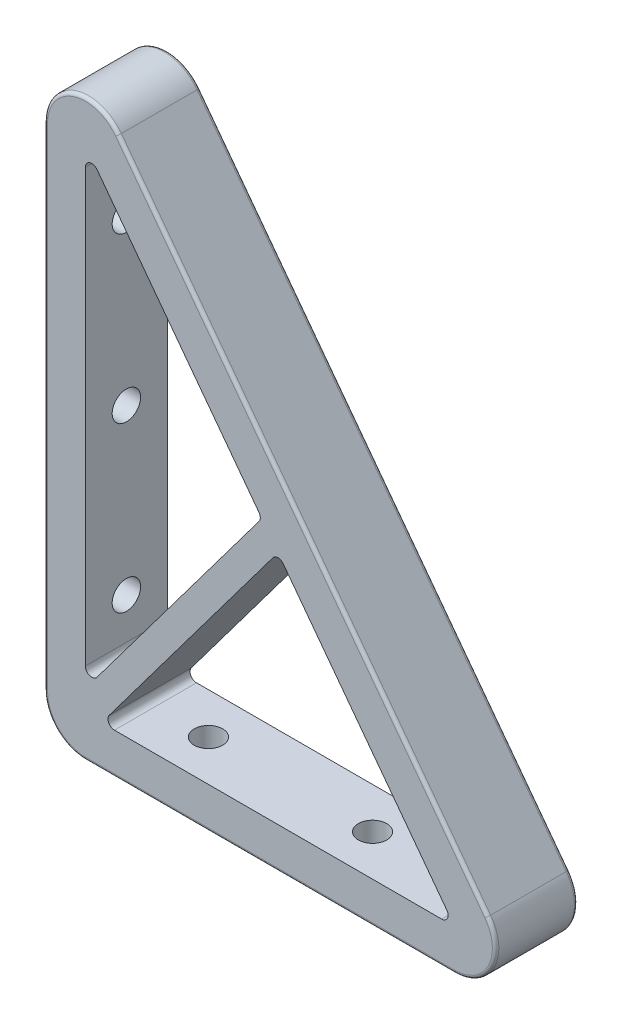
ISO-10303-21;
HEADER;
FILE_DESCRIPTION(('STEP AP214'),'2;1');
FILE_NAME('part.step','',(''),(''),'','','');
FILE_SCHEMA(('AUTOMOTIVE_DESIGN { 1 0 10303 214 1 1 1 1 }'));
ENDSEC;
DATA;
#1=APPLICATION_CONTEXT('core data for automotive mechanical design processes');
#2=APPLICATION_PROTOCOL_DEFINITION('international standard','automotive_design',2000,#1);
#3=PRODUCT_CONTEXT('',#1,'mechanical');
#4=PRODUCT('Part','Part','',(#3));
#5=PRODUCT_RELATED_PRODUCT_CATEGORY('part','',(#4));
#6=PRODUCT_DEFINITION_FORMATION('','',#4);
#7=PRODUCT_DEFINITION_CONTEXT('part definition',#1,'design');
#8=PRODUCT_DEFINITION('design','',#6,#7);
#9=PRODUCT_DEFINITION_SHAPE('','',#8);
#10=(LENGTH_UNIT() NAMED_UNIT(*) SI_UNIT(.MILLI.,.METRE.));
#11=(NAMED_UNIT(*) PLANE_ANGLE_UNIT() SI_UNIT($,.RADIAN.));
#12=(NAMED_UNIT(*) SI_UNIT($,.STERADIAN.) SOLID_ANGLE_UNIT());
#13=UNCERTAINTY_MEASURE_WITH_UNIT(LENGTH_MEASURE(1.E-05),#10,'distance_accuracy_value','');
#14=(GEOMETRIC_REPRESENTATION_CONTEXT(3) GLOBAL_UNCERTAINTY_ASSIGNED_CONTEXT((#13)) GLOBAL_UNIT_ASSIGNED_CONTEXT((#10,
#11,#12)) REPRESENTATION_CONTEXT('',''));
#15=CARTESIAN_POINT('',(0.,0.,0.));
#16=DIRECTION('',(0.,0.,1.));
#17=DIRECTION('',(1.,0.,0.));
#18=AXIS2_PLACEMENT_3D('',#15,#16,#17);
#19=CARTESIAN_POINT('',(0.,0.,12.7));
#20=DIRECTION('',(1.,0.,0.));
#21=DIRECTION('',(0.,1.,0.));
#22=AXIS2_PLACEMENT_3D('',#19,#20,#21);
#23=PLANE('',#22);
#24=CARTESIAN_POINT('',(0.,-82.55,6.35));
#25=DIRECTION('',(-1.,0.,0.));
#26=DIRECTION('',(0.,-1.,0.));
#27=AXIS2_PLACEMENT_3D('',#24,#25,#26);
#28=CIRCLE('',#27,2.19999999999999);
#29=CARTESIAN_POINT('',(0.,-84.75,6.35));
#30=VERTEX_POINT('',#29);
#31=EDGE_CURVE('E824',#30,#30,#28,.T.);
#32=ORIENTED_EDGE('',*,*,#31,.F.);
#33=EDGE_LOOP('',(#32));
#34=FACE_BOUND('',#33,.T.);
#35=CARTESIAN_POINT('',(0.,-57.15,6.35));
#36=DIRECTION('',(-1.,0.,0.));
#37=DIRECTION('',(0.,-1.,0.));
#38=AXIS2_PLACEMENT_3D('',#35,#36,#37);
#39=CIRCLE('',#38,2.2);
#40=CARTESIAN_POINT('',(0.,-59.35,6.35));
#41=VERTEX_POINT('',#40);
#42=EDGE_CURVE('E835',#41,#41,#39,.T.);
#43=ORIENTED_EDGE('',*,*,#42,.F.);
#44=EDGE_LOOP('',(#43));
#45=FACE_BOUND('',#44,.T.);
#46=CARTESIAN_POINT('',(0.,-31.75,6.35));
#47=DIRECTION('',(-1.,0.,0.));
#48=DIRECTION('',(0.,-1.,0.));
#49=AXIS2_PLACEMENT_3D('',#46,#47,#48);
#50=CIRCLE('',#49,2.2);
#51=CARTESIAN_POINT('',(0.,-33.95,6.35));
#52=VERTEX_POINT('',#51);
#53=EDGE_CURVE('E829',#52,#52,#50,.T.);
#54=ORIENTED_EDGE('',*,*,#53,.F.);
#55=EDGE_LOOP('',(#54));
#56=FACE_BOUND('',#55,.T.);
#57=DIRECTION('',(0.,0.,-1.));
#58=VECTOR('',#57,1.);
#59=CARTESIAN_POINT('',(0.,-95.25,12.7));
#60=LINE('',#59,#58);
#61=CARTESIAN_POINT('',(0.,-95.25,0.5));
#62=VERTEX_POINT('',#61);
#63=CARTESIAN_POINT('',(0.,-95.25,12.2));
#64=VERTEX_POINT('',#63);
#65=EDGE_CURVE('E382',#62,#64,#60,.F.);
#66=ORIENTED_EDGE('',*,*,#65,.T.);
#67=DIRECTION('',(0.,-1.,0.));
#68=VECTOR('',#67,1.);
#69=CARTESIAN_POINT('',(0.,-19.05,12.2));
#70=LINE('',#69,#68);
#71=CARTESIAN_POINT('',(0.,-19.05,12.2));
#72=VERTEX_POINT('',#71);
#73=EDGE_CURVE('E11',#64,#72,#70,.F.);
#74=ORIENTED_EDGE('',*,*,#73,.T.);
#75=DIRECTION('',(0.,0.,-1.));
#76=VECTOR('',#75,1.);
#77=CARTESIAN_POINT('',(0.,-19.05,0.));
#78=LINE('',#77,#76);
#79=CARTESIAN_POINT('',(0.,-19.05,0.5));
#80=VERTEX_POINT('',#79);
#81=EDGE_CURVE('E379',#72,#80,#78,.T.);
#82=ORIENTED_EDGE('',*,*,#81,.T.);
#83=DIRECTION('',(0.,-1.,0.));
#84=VECTOR('',#83,1.);
#85=CARTESIAN_POINT('',(0.,0.,0.5));
#86=LINE('',#85,#84);
#87=EDGE_CURVE('E45',#80,#62,#86,.T.);
#88=ORIENTED_EDGE('',*,*,#87,.T.);
#89=EDGE_LOOP('',(#66,#74,#82,#88));
#90=FACE_BOUND('',#89,.T.);
#91=ADVANCED_FACE('F36',(#34,#45,#56,#90),#23,.F.);
#92=CARTESIAN_POINT('',(0.,-101.6,12.7));
#93=DIRECTION('',(0.,1.,0.));
#94=DIRECTION('',(0.,0.,1.));
#95=AXIS2_PLACEMENT_3D('',#92,#93,#94);
#96=PLANE('',#95);
#97=CARTESIAN_POINT('',(19.05,-101.6,6.35));
#98=DIRECTION('',(0.,-1.,0.));
#99=DIRECTION('',(0.,0.,-1.));
#100=AXIS2_PLACEMENT_3D('',#97,#98,#99);
#101=CIRCLE('',#100,2.2);
#102=CARTESIAN_POINT('',(19.05,-101.6,4.15));
#103=VERTEX_POINT('',#102);
#104=EDGE_CURVE('E772',#103,#103,#101,.T.);
#105=ORIENTED_EDGE('',*,*,#104,.F.);
#106=EDGE_LOOP('',(#105));
#107=FACE_BOUND('',#106,.T.);
#108=CARTESIAN_POINT('',(44.45,-101.6,6.35));
#109=DIRECTION('',(0.,-1.,0.));
#110=DIRECTION('',(0.,0.,-1.));
#111=AXIS2_PLACEMENT_3D('',#108,#109,#110);
#112=CIRCLE('',#111,2.2);
#113=CARTESIAN_POINT('',(44.45,-101.6,4.15));
#114=VERTEX_POINT('',#113);
#115=EDGE_CURVE('E817',#114,#114,#112,.T.);
#116=ORIENTED_EDGE('',*,*,#115,.F.);
#117=EDGE_LOOP('',(#116));
#118=FACE_BOUND('',#117,.T.);
#119=DIRECTION('',(0.,0.,-1.));
#120=VECTOR('',#119,1.);
#121=CARTESIAN_POINT('',(6.35000000000001,-101.6,12.7));
#122=LINE('',#121,#120);
#123=CARTESIAN_POINT('',(6.35000000000001,-101.6,12.2));
#124=VERTEX_POINT('',#123);
#125=CARTESIAN_POINT('',(6.35000000000001,-101.6,0.5));
#126=VERTEX_POINT('',#125);
#127=EDGE_CURVE('E370',#124,#126,#122,.T.);
#128=ORIENTED_EDGE('',*,*,#127,.T.);
#129=DIRECTION('',(1.,0.,0.));
#130=VECTOR('',#129,1.);
#131=CARTESIAN_POINT('',(0.,-101.6,0.5));
#132=LINE('',#131,#130);
#133=CARTESIAN_POINT('',(63.5,-101.6,0.5));
#134=VERTEX_POINT('',#133);
#135=EDGE_CURVE('E307',#126,#134,#132,.T.);
#136=ORIENTED_EDGE('',*,*,#135,.T.);
#137=DIRECTION('',(0.,0.,-1.));
#138=VECTOR('',#137,1.);
#139=CARTESIAN_POINT('',(63.5,-101.6,12.7));
#140=LINE('',#139,#138);
#141=CARTESIAN_POINT('',(63.5,-101.6,12.2));
#142=VERTEX_POINT('',#141);
#143=EDGE_CURVE('E373',#134,#142,#140,.F.);
#144=ORIENTED_EDGE('',*,*,#143,.T.);
#145=DIRECTION('',(1.,0.,0.));
#146=VECTOR('',#145,1.);
#147=CARTESIAN_POINT('',(6.35000000000001,-101.6,12.2));
#148=LINE('',#147,#146);
#149=EDGE_CURVE('E305',#142,#124,#148,.F.);
#150=ORIENTED_EDGE('',*,*,#149,.T.);
#151=EDGE_LOOP('',(#128,#136,#144,#150));
#152=FACE_BOUND('',#151,.T.);
#153=ADVANCED_FACE('F369',(#107,#118,#152),#96,.F.);
#154=CARTESIAN_POINT('',(-5.08000000000003,-3.81000000000002,12.7));
#155=DIRECTION('',(-0.8,-0.6,0.));
#156=DIRECTION('',(0.6,-0.8,0.));
#157=AXIS2_PLACEMENT_3D('',#154,#155,#156);
#158=PLANE('',#157);
#159=DIRECTION('',(-0.6,0.8,0.));
#160=VECTOR('',#159,1.);
#161=CARTESIAN_POINT('',(-5.08000000000003,-3.81000000000002,12.7));
#162=LINE('',#161,#160);
#163=CARTESIAN_POINT('',(62.3,-93.65,12.7));
#164=VERTEX_POINT('',#163);
#165=CARTESIAN_POINT('',(36.975,-59.8833333333334,12.7));
#166=VERTEX_POINT('',#165);
#167=EDGE_CURVE('E787',#164,#166,#162,.T.);
#168=ORIENTED_EDGE('',*,*,#167,.T.);
#169=DIRECTION('',(0.,0.,-1.));
#170=VECTOR('',#169,1.);
#171=CARTESIAN_POINT('',(36.975,-59.8833333333334,12.7));
#172=LINE('',#171,#170);
#173=CARTESIAN_POINT('',(36.975,-59.8833333333334,0.));
#174=VERTEX_POINT('',#173);
#175=EDGE_CURVE('E220',#166,#174,#172,.T.);
#176=ORIENTED_EDGE('',*,*,#175,.T.);
#177=DIRECTION('',(-0.6,0.8,0.));
#178=VECTOR('',#177,1.);
#179=CARTESIAN_POINT('',(-5.08000000000003,-3.81000000000002,0.));
#180=LINE('',#179,#178);
#181=CARTESIAN_POINT('',(62.3,-93.65,0.));
#182=VERTEX_POINT('',#181);
#183=EDGE_CURVE('E203',#182,#174,#180,.T.);
#184=ORIENTED_EDGE('',*,*,#183,.F.);
#185=DIRECTION('',(0.,0.,-1.));
#186=VECTOR('',#185,1.);
#187=CARTESIAN_POINT('',(62.3,-93.65,12.7));
#188=LINE('',#187,#186);
#189=EDGE_CURVE('E217',#182,#164,#188,.F.);
#190=ORIENTED_EDGE('',*,*,#189,.T.);
#191=EDGE_LOOP('',(#168,#176,#184,#190));
#192=FACE_BOUND('',#191,.T.);
#193=ADVANCED_FACE('F216',(#192),#158,.T.);
#194=CARTESIAN_POINT('',(0.,-95.25,12.7));
#195=DIRECTION('',(0.,1.,0.));
#196=DIRECTION('',(0.,0.,1.));
#197=AXIS2_PLACEMENT_3D('',#194,#195,#196);
#198=PLANE('',#197);
#199=CARTESIAN_POINT('',(19.05,-95.25,6.35));
#200=DIRECTION('',(0.,1.,0.));
#201=DIRECTION('',(0.,0.,1.));
#202=AXIS2_PLACEMENT_3D('',#199,#200,#201);
#203=CIRCLE('',#202,2.2);
#204=CARTESIAN_POINT('',(19.05,-95.25,8.55));
#205=VERTEX_POINT('',#204);
#206=EDGE_CURVE('E820',#205,#205,#203,.F.);
#207=ORIENTED_EDGE('',*,*,#206,.T.);
#208=EDGE_LOOP('',(#207));
#209=FACE_BOUND('',#208,.T.);
#210=CARTESIAN_POINT('',(44.45,-95.25,6.35));
#211=DIRECTION('',(0.,1.,0.));
#212=DIRECTION('',(0.,0.,1.));
#213=AXIS2_PLACEMENT_3D('',#210,#211,#212);
#214=CIRCLE('',#213,2.2);
#215=CARTESIAN_POINT('',(44.45,-95.25,8.55));
#216=VERTEX_POINT('',#215);
#217=EDGE_CURVE('E821',#216,#216,#214,.F.);
#218=ORIENTED_EDGE('',*,*,#217,.T.);
#219=EDGE_LOOP('',(#218));
#220=FACE_BOUND('',#219,.T.);
#221=DIRECTION('',(1.,0.,0.));
#222=VECTOR('',#221,1.);
#223=CARTESIAN_POINT('',(0.,-95.25,12.7));
#224=LINE('',#223,#222);
#225=CARTESIAN_POINT('',(10.85,-95.25,12.7));
#226=VERTEX_POINT('',#225);
#227=CARTESIAN_POINT('',(61.5,-95.25,12.7));
#228=VERTEX_POINT('',#227);
#229=EDGE_CURVE('E793',#226,#228,#224,.T.);
#230=ORIENTED_EDGE('',*,*,#229,.T.);
#231=DIRECTION('',(0.,0.,-1.));
#232=VECTOR('',#231,1.);
#233=CARTESIAN_POINT('',(61.5,-95.25,0.));
#234=LINE('',#233,#232);
#235=CARTESIAN_POINT('',(61.5,-95.25,0.));
#236=VERTEX_POINT('',#235);
#237=EDGE_CURVE('E256',#228,#236,#234,.T.);
#238=ORIENTED_EDGE('',*,*,#237,.T.);
#239=DIRECTION('',(1.,0.,0.));
#240=VECTOR('',#239,1.);
#241=CARTESIAN_POINT('',(0.,-95.25,0.));
#242=LINE('',#241,#240);
#243=CARTESIAN_POINT('',(10.85,-95.25,0.));
#244=VERTEX_POINT('',#243);
#245=EDGE_CURVE('E205',#244,#236,#242,.T.);
#246=ORIENTED_EDGE('',*,*,#245,.F.);
#247=DIRECTION('',(0.,0.,-1.));
#248=VECTOR('',#247,1.);
#249=CARTESIAN_POINT('',(10.85,-95.25,12.7));
#250=LINE('',#249,#248);
#251=EDGE_CURVE('E254',#244,#226,#250,.F.);
#252=ORIENTED_EDGE('',*,*,#251,.T.);
#253=EDGE_LOOP('',(#230,#238,#246,#252));
#254=FACE_BOUND('',#253,.T.);
#255=ADVANCED_FACE('F453',(#209,#220,#254),#198,.T.);
#256=CARTESIAN_POINT('',(33.225,-54.8833333333334,0.));
#257=VERTEX_POINT('',#256);
#258=CARTESIAN_POINT('',(8.15,-21.4500000000001,0.));
#259=VERTEX_POINT('',#258);
#260=EDGE_CURVE('E223',#257,#259,#180,.T.);
#261=ORIENTED_EDGE('',*,*,#260,.F.);
#262=DIRECTION('',(0.,0.,-1.));
#263=VECTOR('',#262,1.);
#264=CARTESIAN_POINT('',(33.225,-54.8833333333334,12.7));
#265=LINE('',#264,#263);
#266=CARTESIAN_POINT('',(33.225,-54.8833333333334,12.7));
#267=VERTEX_POINT('',#266);
#268=EDGE_CURVE('E247',#257,#267,#265,.F.);
#269=ORIENTED_EDGE('',*,*,#268,.T.);
#270=CARTESIAN_POINT('',(8.15,-21.4500000000001,12.7));
#271=VERTEX_POINT('',#270);
#272=EDGE_CURVE('E780',#267,#271,#162,.T.);
#273=ORIENTED_EDGE('',*,*,#272,.T.);
#274=DIRECTION('',(0.,0.,-1.));
#275=VECTOR('',#274,1.);
#276=CARTESIAN_POINT('',(8.15,-21.4500000000001,0.));
#277=LINE('',#276,#275);
#278=EDGE_CURVE('E244',#271,#259,#277,.T.);
#279=ORIENTED_EDGE('',*,*,#278,.T.);
#280=EDGE_LOOP('',(#261,#269,#273,#279));
#281=FACE_BOUND('',#280,.T.);
#282=ADVANCED_FACE('F456',(#281),#158,.T.);
#283=CARTESIAN_POINT('',(48.184,-36.138,12.7));
#284=DIRECTION('',(-0.8,0.6,0.));
#285=DIRECTION('',(-0.6,-0.8,0.));
#286=AXIS2_PLACEMENT_3D('',#283,#284,#285);
#287=PLANE('',#286);
#288=DIRECTION('',(0.6,0.8,0.));
#289=VECTOR('',#288,1.);
#290=CARTESIAN_POINT('',(48.184,-36.138,12.7));
#291=LINE('',#290,#289);
#292=CARTESIAN_POINT('',(8.15,-89.5166666666667,12.7));
#293=VERTEX_POINT('',#292);
#294=CARTESIAN_POINT('',(33.225,-56.0833333333333,12.7));
#295=VERTEX_POINT('',#294);
#296=EDGE_CURVE('E778',#293,#295,#291,.T.);
#297=ORIENTED_EDGE('',*,*,#296,.T.);
#298=DIRECTION('',(0.,0.,-1.));
#299=VECTOR('',#298,1.);
#300=CARTESIAN_POINT('',(33.225,-56.0833333333333,0.));
#301=LINE('',#300,#299);
#302=CARTESIAN_POINT('',(33.225,-56.0833333333333,0.));
#303=VERTEX_POINT('',#302);
#304=EDGE_CURVE('E241',#295,#303,#301,.T.);
#305=ORIENTED_EDGE('',*,*,#304,.T.);
#306=DIRECTION('',(0.6,0.8,0.));
#307=VECTOR('',#306,1.);
#308=CARTESIAN_POINT('',(48.184,-36.138,0.));
#309=LINE('',#308,#307);
#310=CARTESIAN_POINT('',(8.15,-89.5166666666667,0.));
#311=VERTEX_POINT('',#310);
#312=EDGE_CURVE('E771',#311,#303,#309,.T.);
#313=ORIENTED_EDGE('',*,*,#312,.F.);
#314=DIRECTION('',(0.,0.,-1.));
#315=VECTOR('',#314,1.);
#316=CARTESIAN_POINT('',(8.15000000000001,-89.5166666666667,12.7));
#317=LINE('',#316,#315);
#318=EDGE_CURVE('E239',#311,#293,#317,.F.);
#319=ORIENTED_EDGE('',*,*,#318,.T.);
#320=EDGE_LOOP('',(#297,#305,#313,#319));
#321=FACE_BOUND('',#320,.T.);
#322=ADVANCED_FACE('F451',(#321),#287,.T.);
#323=CARTESIAN_POINT('',(51.384,-38.538,12.7));
#324=DIRECTION('',(-0.8,0.6,0.));
#325=DIRECTION('',(-0.6,-0.8,0.));
#326=AXIS2_PLACEMENT_3D('',#323,#324,#325);
#327=PLANE('',#326);
#328=DIRECTION('',(0.6,0.8,0.));
#329=VECTOR('',#328,1.);
#330=CARTESIAN_POINT('',(51.384,-38.538,0.));
#331=LINE('',#330,#329);
#332=CARTESIAN_POINT('',(10.05,-93.65,0.));
#333=VERTEX_POINT('',#332);
#334=CARTESIAN_POINT('',(35.375,-59.8833333333334,0.));
#335=VERTEX_POINT('',#334);
#336=EDGE_CURVE('E789',#333,#335,#331,.T.);
#337=ORIENTED_EDGE('',*,*,#336,.T.);
#338=DIRECTION('',(0.,0.,-1.));
#339=VECTOR('',#338,1.);
#340=CARTESIAN_POINT('',(35.375,-59.8833333333334,12.7));
#341=LINE('',#340,#339);
#342=CARTESIAN_POINT('',(35.375,-59.8833333333334,12.7));
#343=VERTEX_POINT('',#342);
#344=EDGE_CURVE('E237',#335,#343,#341,.F.);
#345=ORIENTED_EDGE('',*,*,#344,.T.);
#346=DIRECTION('',(0.6,0.8,0.));
#347=VECTOR('',#346,1.);
#348=CARTESIAN_POINT('',(51.384,-38.538,12.7));
#349=LINE('',#348,#347);
#350=CARTESIAN_POINT('',(10.05,-93.65,12.7));
#351=VERTEX_POINT('',#350);
#352=EDGE_CURVE('E384',#351,#343,#349,.T.);
#353=ORIENTED_EDGE('',*,*,#352,.F.);
#354=DIRECTION('',(0.,0.,-1.));
#355=VECTOR('',#354,1.);
#356=CARTESIAN_POINT('',(10.05,-93.65,12.7));
#357=LINE('',#356,#355);
#358=EDGE_CURVE('E228',#351,#333,#357,.T.);
#359=ORIENTED_EDGE('',*,*,#358,.T.);
#360=EDGE_LOOP('',(#337,#345,#353,#359));
#361=FACE_BOUND('',#360,.T.);
#362=ADVANCED_FACE('F447',(#361),#327,.F.);
#363=CARTESIAN_POINT('',(6.35,0.,12.7));
#364=DIRECTION('',(1.,0.,0.));
#365=DIRECTION('',(0.,1.,0.));
#366=AXIS2_PLACEMENT_3D('',#363,#364,#365);
#367=PLANE('',#366);
#368=CARTESIAN_POINT('',(6.35000000000001,-82.55,6.35));
#369=DIRECTION('',(1.,0.,0.));
#370=DIRECTION('',(0.,1.,0.));
#371=AXIS2_PLACEMENT_3D('',#368,#369,#370);
#372=CIRCLE('',#371,2.19999999999999);
#373=CARTESIAN_POINT('',(6.35000000000001,-80.35,6.35));
#374=VERTEX_POINT('',#373);
#375=EDGE_CURVE('E838',#374,#374,#372,.F.);
#376=ORIENTED_EDGE('',*,*,#375,.T.);
#377=EDGE_LOOP('',(#376));
#378=FACE_BOUND('',#377,.T.);
#379=CARTESIAN_POINT('',(6.35000000000001,-57.15,6.35));
#380=DIRECTION('',(1.,0.,0.));
#381=DIRECTION('',(0.,1.,0.));
#382=AXIS2_PLACEMENT_3D('',#379,#380,#381);
#383=CIRCLE('',#382,2.2);
#384=CARTESIAN_POINT('',(6.35000000000001,-54.95,6.35));
#385=VERTEX_POINT('',#384);
#386=EDGE_CURVE('E832',#385,#385,#383,.F.);
#387=ORIENTED_EDGE('',*,*,#386,.T.);
#388=EDGE_LOOP('',(#387));
#389=FACE_BOUND('',#388,.T.);
#390=CARTESIAN_POINT('',(6.34999999999999,-31.75,6.35));
#391=DIRECTION('',(1.,0.,0.));
#392=DIRECTION('',(0.,1.,0.));
#393=AXIS2_PLACEMENT_3D('',#390,#391,#392);
#394=CIRCLE('',#393,2.2);
#395=CARTESIAN_POINT('',(6.34999999999999,-29.55,6.35));
#396=VERTEX_POINT('',#395);
#397=EDGE_CURVE('E341',#396,#396,#394,.F.);
#398=ORIENTED_EDGE('',*,*,#397,.T.);
#399=EDGE_LOOP('',(#398));
#400=FACE_BOUND('',#399,.T.);
#401=DIRECTION('',(0.,-1.,0.));
#402=VECTOR('',#401,1.);
#403=CARTESIAN_POINT('',(6.35,0.,12.7));
#404=LINE('',#403,#402);
#405=CARTESIAN_POINT('',(6.35,-22.0500000000001,12.7));
#406=VERTEX_POINT('',#405);
#407=CARTESIAN_POINT('',(6.35000000000001,-88.9166666666667,12.7));
#408=VERTEX_POINT('',#407);
#409=EDGE_CURVE('E784',#406,#408,#404,.T.);
#410=ORIENTED_EDGE('',*,*,#409,.T.);
#411=DIRECTION('',(0.,0.,-1.));
#412=VECTOR('',#411,1.);
#413=CARTESIAN_POINT('',(6.35000000000001,-88.9166666666667,0.));
#414=LINE('',#413,#412);
#415=CARTESIAN_POINT('',(6.35000000000001,-88.9166666666667,0.));
#416=VERTEX_POINT('',#415);
#417=EDGE_CURVE('E251',#408,#416,#414,.T.);
#418=ORIENTED_EDGE('',*,*,#417,.T.);
#419=DIRECTION('',(0.,-1.,0.));
#420=VECTOR('',#419,1.);
#421=CARTESIAN_POINT('',(6.35,0.,0.));
#422=LINE('',#421,#420);
#423=CARTESIAN_POINT('',(6.35,-22.0500000000001,0.));
#424=VERTEX_POINT('',#423);
#425=EDGE_CURVE('E221',#424,#416,#422,.T.);
#426=ORIENTED_EDGE('',*,*,#425,.F.);
#427=DIRECTION('',(0.,0.,-1.));
#428=VECTOR('',#427,1.);
#429=CARTESIAN_POINT('',(6.35,-22.0500000000001,12.7));
#430=LINE('',#429,#428);
#431=EDGE_CURVE('E249',#424,#406,#430,.F.);
#432=ORIENTED_EDGE('',*,*,#431,.T.);
#433=EDGE_LOOP('',(#410,#418,#426,#432));
#434=FACE_BOUND('',#433,.T.);
#435=ADVANCED_FACE('F450',(#378,#389,#400,#434),#367,.T.);
#436=CARTESIAN_POINT('',(0.,0.,12.7));
#437=DIRECTION('',(0.8,0.6,0.));
#438=DIRECTION('',(-0.6,0.8,0.));
#439=AXIS2_PLACEMENT_3D('',#436,#437,#438);
#440=PLANE('',#439);
#441=DIRECTION('',(0.,0.,-1.));
#442=VECTOR('',#441,1.);
#443=CARTESIAN_POINT('',(68.58,-91.44,0.));
#444=LINE('',#443,#442);
#445=CARTESIAN_POINT('',(68.58,-91.44,12.2));
#446=VERTEX_POINT('',#445);
#447=CARTESIAN_POINT('',(68.58,-91.44,0.5));
#448=VERTEX_POINT('',#447);
#449=EDGE_CURVE('E231',#446,#448,#444,.T.);
#450=ORIENTED_EDGE('',*,*,#449,.T.);
#451=DIRECTION('',(0.6,-0.8,0.));
#452=VECTOR('',#451,1.);
#453=CARTESIAN_POINT('',(11.43,-15.24,0.5));
#454=LINE('',#453,#452);
#455=CARTESIAN_POINT('',(11.43,-15.24,0.5));
#456=VERTEX_POINT('',#455);
#457=EDGE_CURVE('E299',#448,#456,#454,.F.);
#458=ORIENTED_EDGE('',*,*,#457,.T.);
#459=DIRECTION('',(0.,0.,-1.));
#460=VECTOR('',#459,1.);
#461=CARTESIAN_POINT('',(11.43,-15.24,12.7));
#462=LINE('',#461,#460);
#463=CARTESIAN_POINT('',(11.43,-15.24,12.2));
#464=VERTEX_POINT('',#463);
#465=EDGE_CURVE('E226',#456,#464,#462,.F.);
#466=ORIENTED_EDGE('',*,*,#465,.T.);
#467=DIRECTION('',(0.6,-0.8,0.));
#468=VECTOR('',#467,1.);
#469=CARTESIAN_POINT('',(0.,0.,12.2));
#470=LINE('',#469,#468);
#471=EDGE_CURVE('E297',#464,#446,#470,.T.);
#472=ORIENTED_EDGE('',*,*,#471,.T.);
#473=EDGE_LOOP('',(#450,#458,#466,#472));
#474=FACE_BOUND('',#473,.T.);
#475=ADVANCED_FACE('F392',(#474),#440,.T.);
#476=CARTESIAN_POINT('',(0.,0.,12.7));
#477=DIRECTION('',(0.,0.,1.));
#478=DIRECTION('',(1.,0.,0.));
#479=AXIS2_PLACEMENT_3D('',#476,#477,#478);
#480=PLANE('',#479);
#481=DIRECTION('',(0.6,-0.8,0.));
#482=VECTOR('',#481,1.);
#483=CARTESIAN_POINT('',(-0.399999999999999,-0.299999999999999,12.7));
#484=LINE('',#483,#482);
#485=CARTESIAN_POINT('',(68.18,-91.74,12.7));
#486=VERTEX_POINT('',#485);
#487=CARTESIAN_POINT('',(11.03,-15.54,12.7));
#488=VERTEX_POINT('',#487);
#489=EDGE_CURVE('E313',#486,#488,#484,.F.);
#490=ORIENTED_EDGE('',*,*,#489,.T.);
#491=CARTESIAN_POINT('',(6.35,-19.05,12.7));
#492=DIRECTION('',(0.,0.,1.));
#493=DIRECTION('',(1.,0.,0.));
#494=AXIS2_PLACEMENT_3D('',#491,#492,#493);
#495=CIRCLE('',#494,5.85);
#496=CARTESIAN_POINT('',(0.500000000000002,-19.05,12.7));
#497=VERTEX_POINT('',#496);
#498=EDGE_CURVE('E322',#488,#497,#495,.T.);
#499=ORIENTED_EDGE('',*,*,#498,.T.);
#500=DIRECTION('',(0.,-1.,0.));
#501=VECTOR('',#500,1.);
#502=CARTESIAN_POINT('',(0.500000000000012,-95.25,12.7));
#503=LINE('',#502,#501);
#504=CARTESIAN_POINT('',(0.500000000000012,-95.25,12.7));
#505=VERTEX_POINT('',#504);
#506=EDGE_CURVE('E60',#497,#505,#503,.T.);
#507=ORIENTED_EDGE('',*,*,#506,.T.);
#508=CARTESIAN_POINT('',(6.35000000000001,-95.25,12.7));
#509=DIRECTION('',(0.,0.,1.));
#510=DIRECTION('',(1.,0.,0.));
#511=AXIS2_PLACEMENT_3D('',#508,#509,#510);
#512=CIRCLE('',#511,5.85);
#513=CARTESIAN_POINT('',(6.35000000000001,-101.1,12.7));
#514=VERTEX_POINT('',#513);
#515=EDGE_CURVE('E319',#505,#514,#512,.T.);
#516=ORIENTED_EDGE('',*,*,#515,.T.);
#517=DIRECTION('',(1.,0.,0.));
#518=VECTOR('',#517,1.);
#519=CARTESIAN_POINT('',(63.5,-101.1,12.7));
#520=LINE('',#519,#518);
#521=CARTESIAN_POINT('',(63.5,-101.1,12.7));
#522=VERTEX_POINT('',#521);
#523=EDGE_CURVE('E317',#514,#522,#520,.T.);
#524=ORIENTED_EDGE('',*,*,#523,.T.);
#525=CARTESIAN_POINT('',(63.5,-95.25,12.7));
#526=DIRECTION('',(0.,0.,1.));
#527=DIRECTION('',(1.,0.,0.));
#528=AXIS2_PLACEMENT_3D('',#525,#526,#527);
#529=CIRCLE('',#528,5.85);
#530=EDGE_CURVE('E315',#522,#486,#529,.T.);
#531=ORIENTED_EDGE('',*,*,#530,.T.);
#532=EDGE_LOOP('',(#490,#499,#507,#516,#524,#531));
#533=FACE_BOUND('',#532,.T.);
#534=ORIENTED_EDGE('',*,*,#272,.F.);
#535=CARTESIAN_POINT('',(32.425,-55.4833333333334,12.7));
#536=DIRECTION('',(0.,0.,1.));
#537=DIRECTION('',(1.,0.,0.));
#538=AXIS2_PLACEMENT_3D('',#535,#536,#537);
#539=CIRCLE('',#538,1.);
#540=EDGE_CURVE('E264',#267,#295,#539,.F.);
#541=ORIENTED_EDGE('',*,*,#540,.T.);
#542=ORIENTED_EDGE('',*,*,#296,.F.);
#543=CARTESIAN_POINT('',(7.35000000000001,-88.9166666666667,12.7));
#544=DIRECTION('',(0.,0.,1.));
#545=DIRECTION('',(1.,0.,0.));
#546=AXIS2_PLACEMENT_3D('',#543,#544,#545);
#547=CIRCLE('',#546,1.);
#548=EDGE_CURVE('E211',#293,#408,#547,.F.);
#549=ORIENTED_EDGE('',*,*,#548,.T.);
#550=ORIENTED_EDGE('',*,*,#409,.F.);
#551=CARTESIAN_POINT('',(7.35,-22.0500000000001,12.7));
#552=DIRECTION('',(0.,0.,1.));
#553=DIRECTION('',(1.,0.,0.));
#554=AXIS2_PLACEMENT_3D('',#551,#552,#553);
#555=CIRCLE('',#554,1.);
#556=EDGE_CURVE('E272',#406,#271,#555,.F.);
#557=ORIENTED_EDGE('',*,*,#556,.T.);
#558=EDGE_LOOP('',(#534,#541,#542,#549,#550,#557));
#559=FACE_BOUND('',#558,.T.);
#560=ORIENTED_EDGE('',*,*,#167,.F.);
#561=CARTESIAN_POINT('',(61.5,-94.25,12.7));
#562=DIRECTION('',(0.,0.,1.));
#563=DIRECTION('',(1.,0.,0.));
#564=AXIS2_PLACEMENT_3D('',#561,#562,#563);
#565=CIRCLE('',#564,1.);
#566=EDGE_CURVE('E210',#164,#228,#565,.F.);
#567=ORIENTED_EDGE('',*,*,#566,.T.);
#568=ORIENTED_EDGE('',*,*,#229,.F.);
#569=CARTESIAN_POINT('',(10.85,-94.25,12.7));
#570=DIRECTION('',(0.,0.,1.));
#571=DIRECTION('',(1.,0.,0.));
#572=AXIS2_PLACEMENT_3D('',#569,#570,#571);
#573=CIRCLE('',#572,1.);
#574=EDGE_CURVE('E276',#226,#351,#573,.F.);
#575=ORIENTED_EDGE('',*,*,#574,.T.);
#576=ORIENTED_EDGE('',*,*,#352,.T.);
#577=CARTESIAN_POINT('',(36.175,-60.4833333333334,12.7));
#578=DIRECTION('',(0.,0.,1.));
#579=DIRECTION('',(1.,0.,0.));
#580=AXIS2_PLACEMENT_3D('',#577,#578,#579);
#581=CIRCLE('',#580,1.);
#582=EDGE_CURVE('E260',#343,#166,#581,.F.);
#583=ORIENTED_EDGE('',*,*,#582,.T.);
#584=EDGE_LOOP('',(#560,#567,#568,#575,#576,#583));
#585=FACE_BOUND('',#584,.T.);
#586=ADVANCED_FACE('F419',(#533,#559,#585),#480,.T.);
#587=CARTESIAN_POINT('',(0.,0.,0.));
#588=DIRECTION('',(0.,0.,1.));
#589=DIRECTION('',(1.,0.,0.));
#590=AXIS2_PLACEMENT_3D('',#587,#588,#589);
#591=PLANE('',#590);
#592=DIRECTION('',(0.,-1.,0.));
#593=VECTOR('',#592,1.);
#594=CARTESIAN_POINT('',(0.5,0.,0.));
#595=LINE('',#594,#593);
#596=CARTESIAN_POINT('',(0.500000000000012,-95.25,0.));
#597=VERTEX_POINT('',#596);
#598=CARTESIAN_POINT('',(0.500000000000002,-19.05,0.));
#599=VERTEX_POINT('',#598);
#600=EDGE_CURVE('E278',#597,#599,#595,.F.);
#601=ORIENTED_EDGE('',*,*,#600,.T.);
#602=CARTESIAN_POINT('',(6.35,-19.05,0.));
#603=DIRECTION('',(0.,0.,1.));
#604=DIRECTION('',(1.,0.,0.));
#605=AXIS2_PLACEMENT_3D('',#602,#603,#604);
#606=CIRCLE('',#605,5.85);
#607=CARTESIAN_POINT('',(11.03,-15.54,0.));
#608=VERTEX_POINT('',#607);
#609=EDGE_CURVE('E288',#599,#608,#606,.F.);
#610=ORIENTED_EDGE('',*,*,#609,.T.);
#611=DIRECTION('',(0.6,-0.8,0.));
#612=VECTOR('',#611,1.);
#613=CARTESIAN_POINT('',(68.18,-91.74,0.));
#614=LINE('',#613,#612);
#615=CARTESIAN_POINT('',(68.18,-91.74,0.));
#616=VERTEX_POINT('',#615);
#617=EDGE_CURVE('E286',#608,#616,#614,.T.);
#618=ORIENTED_EDGE('',*,*,#617,.T.);
#619=CARTESIAN_POINT('',(63.5,-95.25,0.));
#620=DIRECTION('',(0.,0.,1.));
#621=DIRECTION('',(1.,0.,0.));
#622=AXIS2_PLACEMENT_3D('',#619,#620,#621);
#623=CIRCLE('',#622,5.85);
#624=CARTESIAN_POINT('',(63.5,-101.1,0.));
#625=VERTEX_POINT('',#624);
#626=EDGE_CURVE('E284',#616,#625,#623,.F.);
#627=ORIENTED_EDGE('',*,*,#626,.T.);
#628=DIRECTION('',(1.,0.,0.));
#629=VECTOR('',#628,1.);
#630=CARTESIAN_POINT('',(0.,-101.1,0.));
#631=LINE('',#630,#629);
#632=CARTESIAN_POINT('',(6.35000000000001,-101.1,0.));
#633=VERTEX_POINT('',#632);
#634=EDGE_CURVE('E282',#625,#633,#631,.F.);
#635=ORIENTED_EDGE('',*,*,#634,.T.);
#636=CARTESIAN_POINT('',(6.35000000000001,-95.25,0.));
#637=DIRECTION('',(0.,0.,1.));
#638=DIRECTION('',(1.,0.,0.));
#639=AXIS2_PLACEMENT_3D('',#636,#637,#638);
#640=CIRCLE('',#639,5.85);
#641=EDGE_CURVE('E280',#633,#597,#640,.F.);
#642=ORIENTED_EDGE('',*,*,#641,.T.);
#643=EDGE_LOOP('',(#601,#610,#618,#627,#635,#642));
#644=FACE_BOUND('',#643,.T.);
#645=ORIENTED_EDGE('',*,*,#312,.T.);
#646=CARTESIAN_POINT('',(32.425,-55.4833333333334,0.));
#647=DIRECTION('',(0.,0.,1.));
#648=DIRECTION('',(1.,0.,0.));
#649=AXIS2_PLACEMENT_3D('',#646,#647,#648);
#650=CIRCLE('',#649,1.);
#651=EDGE_CURVE('E262',#303,#257,#650,.T.);
#652=ORIENTED_EDGE('',*,*,#651,.T.);
#653=ORIENTED_EDGE('',*,*,#260,.T.);
#654=CARTESIAN_POINT('',(7.35,-22.0500000000001,0.));
#655=DIRECTION('',(0.,0.,1.));
#656=DIRECTION('',(1.,0.,0.));
#657=AXIS2_PLACEMENT_3D('',#654,#655,#656);
#658=CIRCLE('',#657,1.);
#659=EDGE_CURVE('E270',#259,#424,#658,.T.);
#660=ORIENTED_EDGE('',*,*,#659,.T.);
#661=ORIENTED_EDGE('',*,*,#425,.T.);
#662=CARTESIAN_POINT('',(7.35000000000001,-88.9166666666667,0.));
#663=DIRECTION('',(0.,0.,1.));
#664=DIRECTION('',(1.,0.,0.));
#665=AXIS2_PLACEMENT_3D('',#662,#663,#664);
#666=CIRCLE('',#665,1.);
#667=EDGE_CURVE('E266',#416,#311,#666,.T.);
#668=ORIENTED_EDGE('',*,*,#667,.T.);
#669=EDGE_LOOP('',(#645,#652,#653,#660,#661,#668));
#670=FACE_BOUND('',#669,.T.);
#671=ORIENTED_EDGE('',*,*,#245,.T.);
#672=CARTESIAN_POINT('',(61.5,-94.25,0.));
#673=DIRECTION('',(0.,0.,1.));
#674=DIRECTION('',(1.,0.,0.));
#675=AXIS2_PLACEMENT_3D('',#672,#673,#674);
#676=CIRCLE('',#675,1.);
#677=EDGE_CURVE('E200',#236,#182,#676,.T.);
#678=ORIENTED_EDGE('',*,*,#677,.T.);
#679=ORIENTED_EDGE('',*,*,#183,.T.);
#680=CARTESIAN_POINT('',(36.175,-60.4833333333334,0.));
#681=DIRECTION('',(0.,0.,1.));
#682=DIRECTION('',(1.,0.,0.));
#683=AXIS2_PLACEMENT_3D('',#680,#681,#682);
#684=CIRCLE('',#683,1.);
#685=EDGE_CURVE('E258',#174,#335,#684,.T.);
#686=ORIENTED_EDGE('',*,*,#685,.T.);
#687=ORIENTED_EDGE('',*,*,#336,.F.);
#688=CARTESIAN_POINT('',(10.85,-94.25,0.));
#689=DIRECTION('',(0.,0.,1.));
#690=DIRECTION('',(1.,0.,0.));
#691=AXIS2_PLACEMENT_3D('',#688,#689,#690);
#692=CIRCLE('',#691,1.);
#693=EDGE_CURVE('E274',#333,#244,#692,.T.);
#694=ORIENTED_EDGE('',*,*,#693,.T.);
#695=EDGE_LOOP('',(#671,#678,#679,#686,#687,#694));
#696=FACE_BOUND('',#695,.T.);
#697=ADVANCED_FACE('F202',(#644,#670,#696),#591,.F.);
#698=CARTESIAN_POINT('',(6.35000000000001,-95.25,12.7));
#699=DIRECTION('',(0.,0.,-1.));
#700=DIRECTION('',(-1.,0.,0.));
#701=AXIS2_PLACEMENT_3D('',#698,#699,#700);
#702=CYLINDRICAL_SURFACE('',#701,6.35);
#703=ORIENTED_EDGE('',*,*,#65,.F.);
#704=CARTESIAN_POINT('',(6.35000000000001,-95.25,0.5));
#705=DIRECTION('',(0.,0.,1.));
#706=DIRECTION('',(1.,0.,0.));
#707=AXIS2_PLACEMENT_3D('',#704,#705,#706);
#708=CIRCLE('',#707,6.35);
#709=EDGE_CURVE('E311',#62,#126,#708,.T.);
#710=ORIENTED_EDGE('',*,*,#709,.T.);
#711=ORIENTED_EDGE('',*,*,#127,.F.);
#712=CARTESIAN_POINT('',(6.35000000000001,-95.25,12.2));
#713=DIRECTION('',(0.,0.,1.));
#714=DIRECTION('',(1.,0.,0.));
#715=AXIS2_PLACEMENT_3D('',#712,#713,#714);
#716=CIRCLE('',#715,6.35);
#717=EDGE_CURVE('E309',#124,#64,#716,.F.);
#718=ORIENTED_EDGE('',*,*,#717,.T.);
#719=EDGE_LOOP('',(#703,#710,#711,#718));
#720=FACE_BOUND('',#719,.T.);
#721=ADVANCED_FACE('F376',(#720),#702,.T.);
#722=CARTESIAN_POINT('',(6.35,-19.05,12.7));
#723=DIRECTION('',(0.,0.,1.));
#724=DIRECTION('',(1.,0.,0.));
#725=AXIS2_PLACEMENT_3D('',#722,#723,#724);
#726=CYLINDRICAL_SURFACE('',#725,6.35);
#727=ORIENTED_EDGE('',*,*,#465,.F.);
#728=CARTESIAN_POINT('',(6.35,-19.05,0.5));
#729=DIRECTION('',(0.,0.,1.));
#730=DIRECTION('',(1.,0.,0.));
#731=AXIS2_PLACEMENT_3D('',#728,#729,#730);
#732=CIRCLE('',#731,6.35);
#733=EDGE_CURVE('E294',#456,#80,#732,.T.);
#734=ORIENTED_EDGE('',*,*,#733,.T.);
#735=ORIENTED_EDGE('',*,*,#81,.F.);
#736=CARTESIAN_POINT('',(6.35,-19.05,12.2));
#737=DIRECTION('',(0.,0.,1.));
#738=DIRECTION('',(1.,0.,0.));
#739=AXIS2_PLACEMENT_3D('',#736,#737,#738);
#740=CIRCLE('',#739,6.35);
#741=EDGE_CURVE('E291',#72,#464,#740,.F.);
#742=ORIENTED_EDGE('',*,*,#741,.T.);
#743=EDGE_LOOP('',(#727,#734,#735,#742));
#744=FACE_BOUND('',#743,.T.);
#745=ADVANCED_FACE('F413',(#744),#726,.T.);
#746=CARTESIAN_POINT('',(63.5,-95.25,12.7));
#747=DIRECTION('',(0.,0.,1.));
#748=DIRECTION('',(1.,0.,0.));
#749=AXIS2_PLACEMENT_3D('',#746,#747,#748);
#750=CYLINDRICAL_SURFACE('',#749,6.35);
#751=ORIENTED_EDGE('',*,*,#143,.F.);
#752=CARTESIAN_POINT('',(63.5,-95.25,0.5));
#753=DIRECTION('',(0.,0.,1.));
#754=DIRECTION('',(1.,0.,0.));
#755=AXIS2_PLACEMENT_3D('',#752,#753,#754);
#756=CIRCLE('',#755,6.35);
#757=EDGE_CURVE('E303',#134,#448,#756,.T.);
#758=ORIENTED_EDGE('',*,*,#757,.T.);
#759=ORIENTED_EDGE('',*,*,#449,.F.);
#760=CARTESIAN_POINT('',(63.5,-95.25,12.2));
#761=DIRECTION('',(0.,0.,1.));
#762=DIRECTION('',(1.,0.,0.));
#763=AXIS2_PLACEMENT_3D('',#760,#761,#762);
#764=CIRCLE('',#763,6.35);
#765=EDGE_CURVE('E301',#446,#142,#764,.F.);
#766=ORIENTED_EDGE('',*,*,#765,.T.);
#767=EDGE_LOOP('',(#751,#758,#759,#766));
#768=FACE_BOUND('',#767,.T.);
#769=ADVANCED_FACE('F470',(#768),#750,.T.);
#770=CARTESIAN_POINT('',(36.175,-60.4833333333334,12.7));
#771=DIRECTION('',(0.,0.,-1.));
#772=DIRECTION('',(-1.,0.,0.));
#773=AXIS2_PLACEMENT_3D('',#770,#771,#772);
#774=CYLINDRICAL_SURFACE('',#773,1.);
#775=ORIENTED_EDGE('',*,*,#582,.F.);
#776=ORIENTED_EDGE('',*,*,#344,.F.);
#777=ORIENTED_EDGE('',*,*,#685,.F.);
#778=ORIENTED_EDGE('',*,*,#175,.F.);
#779=EDGE_LOOP('',(#775,#776,#777,#778));
#780=FACE_BOUND('',#779,.T.);
#781=ADVANCED_FACE('F473',(#780),#774,.F.);
#782=CARTESIAN_POINT('',(32.425,-55.4833333333334,12.7));
#783=DIRECTION('',(0.,0.,1.));
#784=DIRECTION('',(1.,0.,0.));
#785=AXIS2_PLACEMENT_3D('',#782,#783,#784);
#786=CYLINDRICAL_SURFACE('',#785,1.);
#787=ORIENTED_EDGE('',*,*,#540,.F.);
#788=ORIENTED_EDGE('',*,*,#268,.F.);
#789=ORIENTED_EDGE('',*,*,#651,.F.);
#790=ORIENTED_EDGE('',*,*,#304,.F.);
#791=EDGE_LOOP('',(#787,#788,#789,#790));
#792=FACE_BOUND('',#791,.T.);
#793=ADVANCED_FACE('F476',(#792),#786,.F.);
#794=CARTESIAN_POINT('',(7.35000000000001,-88.9166666666667,12.7));
#795=DIRECTION('',(0.,0.,1.));
#796=DIRECTION('',(1.,0.,0.));
#797=AXIS2_PLACEMENT_3D('',#794,#795,#796);
#798=CYLINDRICAL_SURFACE('',#797,1.);
#799=ORIENTED_EDGE('',*,*,#548,.F.);
#800=ORIENTED_EDGE('',*,*,#318,.F.);
#801=ORIENTED_EDGE('',*,*,#667,.F.);
#802=ORIENTED_EDGE('',*,*,#417,.F.);
#803=EDGE_LOOP('',(#799,#800,#801,#802));
#804=FACE_BOUND('',#803,.T.);
#805=ADVANCED_FACE('F480',(#804),#798,.F.);
#806=CARTESIAN_POINT('',(61.5,-94.25,12.7));
#807=DIRECTION('',(0.,0.,1.));
#808=DIRECTION('',(1.,0.,0.));
#809=AXIS2_PLACEMENT_3D('',#806,#807,#808);
#810=CYLINDRICAL_SURFACE('',#809,1.);
#811=ORIENTED_EDGE('',*,*,#566,.F.);
#812=ORIENTED_EDGE('',*,*,#189,.F.);
#813=ORIENTED_EDGE('',*,*,#677,.F.);
#814=ORIENTED_EDGE('',*,*,#237,.F.);
#815=EDGE_LOOP('',(#811,#812,#813,#814));
#816=FACE_BOUND('',#815,.T.);
#817=ADVANCED_FACE('F225',(#816),#810,.F.);
#818=CARTESIAN_POINT('',(7.35,-22.0500000000001,12.7));
#819=DIRECTION('',(0.,0.,1.));
#820=DIRECTION('',(1.,0.,0.));
#821=AXIS2_PLACEMENT_3D('',#818,#819,#820);
#822=CYLINDRICAL_SURFACE('',#821,1.);
#823=ORIENTED_EDGE('',*,*,#556,.F.);
#824=ORIENTED_EDGE('',*,*,#431,.F.);
#825=ORIENTED_EDGE('',*,*,#659,.F.);
#826=ORIENTED_EDGE('',*,*,#278,.F.);
#827=EDGE_LOOP('',(#823,#824,#825,#826));
#828=FACE_BOUND('',#827,.T.);
#829=ADVANCED_FACE('F487',(#828),#822,.F.);
#830=CARTESIAN_POINT('',(10.85,-94.25,12.7));
#831=DIRECTION('',(0.,0.,-1.));
#832=DIRECTION('',(-1.,0.,0.));
#833=AXIS2_PLACEMENT_3D('',#830,#831,#832);
#834=CYLINDRICAL_SURFACE('',#833,1.);
#835=ORIENTED_EDGE('',*,*,#574,.F.);
#836=ORIENTED_EDGE('',*,*,#251,.F.);
#837=ORIENTED_EDGE('',*,*,#693,.F.);
#838=ORIENTED_EDGE('',*,*,#358,.F.);
#839=EDGE_LOOP('',(#835,#836,#837,#838));
#840=FACE_BOUND('',#839,.T.);
#841=ADVANCED_FACE('F490',(#840),#834,.F.);
#842=CARTESIAN_POINT('',(44.45,-12.699,6.35));
#843=DIRECTION('',(0.,-1.,0.));
#844=DIRECTION('',(0.,0.,-1.));
#845=AXIS2_PLACEMENT_3D('',#842,#843,#844);
#846=CYLINDRICAL_SURFACE('',#845,2.2);
#847=ORIENTED_EDGE('',*,*,#217,.F.);
#848=EDGE_LOOP('',(#847));
#849=FACE_BOUND('',#848,.T.);
#850=ORIENTED_EDGE('',*,*,#115,.T.);
#851=EDGE_LOOP('',(#850));
#852=FACE_BOUND('',#851,.T.);
#853=ADVANCED_FACE('F494',(#849,#852),#846,.F.);
#854=CARTESIAN_POINT('',(19.05,-12.699,6.35));
#855=DIRECTION('',(0.,-1.,0.));
#856=DIRECTION('',(0.,0.,-1.));
#857=AXIS2_PLACEMENT_3D('',#854,#855,#856);
#858=CYLINDRICAL_SURFACE('',#857,2.2);
#859=ORIENTED_EDGE('',*,*,#206,.F.);
#860=EDGE_LOOP('',(#859));
#861=FACE_BOUND('',#860,.T.);
#862=ORIENTED_EDGE('',*,*,#104,.T.);
#863=EDGE_LOOP('',(#862));
#864=FACE_BOUND('',#863,.T.);
#865=ADVANCED_FACE('F670',(#861,#864),#858,.F.);
#866=CARTESIAN_POINT('',(69.851,-31.75,6.35));
#867=DIRECTION('',(-1.,0.,0.));
#868=DIRECTION('',(0.,-1.,0.));
#869=AXIS2_PLACEMENT_3D('',#866,#867,#868);
#870=CYLINDRICAL_SURFACE('',#869,2.2);
#871=ORIENTED_EDGE('',*,*,#397,.F.);
#872=EDGE_LOOP('',(#871));
#873=FACE_BOUND('',#872,.T.);
#874=ORIENTED_EDGE('',*,*,#53,.T.);
#875=EDGE_LOOP('',(#874));
#876=FACE_BOUND('',#875,.T.);
#877=ADVANCED_FACE('F660',(#873,#876),#870,.F.);
#878=CARTESIAN_POINT('',(69.851,-57.15,6.35));
#879=DIRECTION('',(-1.,0.,0.));
#880=DIRECTION('',(0.,-1.,0.));
#881=AXIS2_PLACEMENT_3D('',#878,#879,#880);
#882=CYLINDRICAL_SURFACE('',#881,2.2);
#883=ORIENTED_EDGE('',*,*,#386,.F.);
#884=EDGE_LOOP('',(#883));
#885=FACE_BOUND('',#884,.T.);
#886=ORIENTED_EDGE('',*,*,#42,.T.);
#887=EDGE_LOOP('',(#886));
#888=FACE_BOUND('',#887,.T.);
#889=ADVANCED_FACE('F650',(#885,#888),#882,.F.);
#890=CARTESIAN_POINT('',(69.851,-82.55,6.35));
#891=DIRECTION('',(-1.,0.,0.));
#892=DIRECTION('',(0.,-1.,0.));
#893=AXIS2_PLACEMENT_3D('',#890,#891,#892);
#894=CYLINDRICAL_SURFACE('',#893,2.19999999999999);
#895=ORIENTED_EDGE('',*,*,#375,.F.);
#896=EDGE_LOOP('',(#895));
#897=FACE_BOUND('',#896,.T.);
#898=ORIENTED_EDGE('',*,*,#31,.T.);
#899=EDGE_LOOP('',(#898));
#900=FACE_BOUND('',#899,.T.);
#901=ADVANCED_FACE('F513',(#897,#900),#894,.F.);
#902=CARTESIAN_POINT('',(0.,-101.1,0.5));
#903=DIRECTION('',(1.,0.,0.));
#904=DIRECTION('',(0.,0.,-1.));
#905=AXIS2_PLACEMENT_3D('',#902,#903,#904);
#906=CYLINDRICAL_SURFACE('',#905,0.5);
#907=CARTESIAN_POINT('',(63.5,-101.1,0.5));
#908=DIRECTION('',(1.,0.,0.));
#909=DIRECTION('',(0.,0.,-1.));
#910=AXIS2_PLACEMENT_3D('',#907,#908,#909);
#911=CIRCLE('',#910,0.5);
#912=EDGE_CURVE('E335',#134,#625,#911,.T.);
#913=ORIENTED_EDGE('',*,*,#912,.F.);
#914=ORIENTED_EDGE('',*,*,#135,.F.);
#915=CARTESIAN_POINT('',(6.35000000000001,-101.1,0.5));
#916=DIRECTION('',(-1.,0.,0.));
#917=DIRECTION('',(0.,0.,1.));
#918=AXIS2_PLACEMENT_3D('',#915,#916,#917);
#919=CIRCLE('',#918,0.5);
#920=EDGE_CURVE('E338',#633,#126,#919,.T.);
#921=ORIENTED_EDGE('',*,*,#920,.F.);
#922=ORIENTED_EDGE('',*,*,#634,.F.);
#923=EDGE_LOOP('',(#913,#914,#921,#922));
#924=FACE_BOUND('',#923,.T.);
#925=ADVANCED_FACE('F509',(#924),#906,.T.);
#926=CARTESIAN_POINT('',(6.35000000000001,-95.25,0.5));
#927=DIRECTION('',(0.,0.,1.));
#928=DIRECTION('',(1.,0.,0.));
#929=AXIS2_PLACEMENT_3D('',#926,#927,#928);
#930=TOROIDAL_SURFACE('',#929,5.85,0.5);
#931=ORIENTED_EDGE('',*,*,#920,.T.);
#932=ORIENTED_EDGE('',*,*,#709,.F.);
#933=CARTESIAN_POINT('',(0.500000000000012,-95.25,0.5));
#934=DIRECTION('',(0.,1.,0.));
#935=DIRECTION('',(0.,0.,1.));
#936=AXIS2_PLACEMENT_3D('',#933,#934,#935);
#937=CIRCLE('',#936,0.5);
#938=EDGE_CURVE('E332',#597,#62,#937,.T.);
#939=ORIENTED_EDGE('',*,*,#938,.F.);
#940=ORIENTED_EDGE('',*,*,#641,.F.);
#941=EDGE_LOOP('',(#931,#932,#939,#940));
#942=FACE_BOUND('',#941,.T.);
#943=ADVANCED_FACE('F506',(#942),#930,.T.);
#944=CARTESIAN_POINT('',(63.5,-95.25,0.5));
#945=DIRECTION('',(0.,0.,1.));
#946=DIRECTION('',(1.,0.,0.));
#947=AXIS2_PLACEMENT_3D('',#944,#945,#946);
#948=TOROIDAL_SURFACE('',#947,5.85,0.5);
#949=ORIENTED_EDGE('',*,*,#912,.T.);
#950=ORIENTED_EDGE('',*,*,#626,.F.);
#951=CARTESIAN_POINT('',(68.18,-91.74,0.5));
#952=DIRECTION('',(-0.599999999999996,0.800000000000003,0.));
#953=DIRECTION('',(-0.800000000000003,-0.599999999999996,0.));
#954=AXIS2_PLACEMENT_3D('',#951,#952,#953);
#955=CIRCLE('',#954,0.5);
#956=EDGE_CURVE('E329',#448,#616,#955,.T.);
#957=ORIENTED_EDGE('',*,*,#956,.F.);
#958=ORIENTED_EDGE('',*,*,#757,.F.);
#959=EDGE_LOOP('',(#949,#950,#957,#958));
#960=FACE_BOUND('',#959,.T.);
#961=ADVANCED_FACE('F400',(#960),#948,.T.);
#962=CARTESIAN_POINT('',(0.5,0.,0.5));
#963=DIRECTION('',(0.,-1.,0.));
#964=DIRECTION('',(1.,0.,0.));
#965=AXIS2_PLACEMENT_3D('',#962,#963,#964);
#966=CYLINDRICAL_SURFACE('',#965,0.5);
#967=ORIENTED_EDGE('',*,*,#938,.T.);
#968=ORIENTED_EDGE('',*,*,#87,.F.);
#969=CARTESIAN_POINT('',(0.500000000000002,-19.05,0.5));
#970=DIRECTION('',(0.,1.,0.));
#971=DIRECTION('',(0.,0.,1.));
#972=AXIS2_PLACEMENT_3D('',#969,#970,#971);
#973=CIRCLE('',#972,0.5);
#974=EDGE_CURVE('E327',#599,#80,#973,.T.);
#975=ORIENTED_EDGE('',*,*,#974,.F.);
#976=ORIENTED_EDGE('',*,*,#600,.F.);
#977=EDGE_LOOP('',(#967,#968,#975,#976));
#978=FACE_BOUND('',#977,.T.);
#979=ADVANCED_FACE('F500',(#978),#966,.T.);
#980=CARTESIAN_POINT('',(-0.4,-0.3,0.5));
#981=DIRECTION('',(-0.6,0.8,0.));
#982=DIRECTION('',(-0.8,-0.6,0.));
#983=AXIS2_PLACEMENT_3D('',#980,#981,#982);
#984=CYLINDRICAL_SURFACE('',#983,0.5);
#985=ORIENTED_EDGE('',*,*,#956,.T.);
#986=ORIENTED_EDGE('',*,*,#617,.F.);
#987=CARTESIAN_POINT('',(11.03,-15.54,0.5));
#988=DIRECTION('',(-0.600000000000001,0.799999999999999,0.));
#989=DIRECTION('',(-0.8,-0.600000000000001,0.));
#990=AXIS2_PLACEMENT_3D('',#987,#988,#989);
#991=CIRCLE('',#990,0.5);
#992=EDGE_CURVE('E325',#456,#608,#991,.T.);
#993=ORIENTED_EDGE('',*,*,#992,.F.);
#994=ORIENTED_EDGE('',*,*,#457,.F.);
#995=EDGE_LOOP('',(#985,#986,#993,#994));
#996=FACE_BOUND('',#995,.T.);
#997=ADVANCED_FACE('F404',(#996),#984,.T.);
#998=CARTESIAN_POINT('',(6.35,-19.05,0.5));
#999=DIRECTION('',(0.,0.,1.));
#1000=DIRECTION('',(1.,0.,0.));
#1001=AXIS2_PLACEMENT_3D('',#998,#999,#1000);
#1002=TOROIDAL_SURFACE('',#1001,5.85,0.5);
#1003=ORIENTED_EDGE('',*,*,#974,.T.);
#1004=ORIENTED_EDGE('',*,*,#733,.F.);
#1005=ORIENTED_EDGE('',*,*,#992,.T.);
#1006=ORIENTED_EDGE('',*,*,#609,.F.);
#1007=EDGE_LOOP('',(#1003,#1004,#1005,#1006));
#1008=FACE_BOUND('',#1007,.T.);
#1009=ADVANCED_FACE('F408',(#1008),#1002,.T.);
#1010=CARTESIAN_POINT('',(0.,-101.1,12.2));
#1011=DIRECTION('',(-1.,0.,0.));
#1012=DIRECTION('',(0.,0.,1.));
#1013=AXIS2_PLACEMENT_3D('',#1010,#1011,#1012);
#1014=CYLINDRICAL_SURFACE('',#1013,0.5);
#1015=CARTESIAN_POINT('',(6.35000000000001,-101.1,12.2));
#1016=DIRECTION('',(-1.,0.,0.));
#1017=DIRECTION('',(0.,0.,1.));
#1018=AXIS2_PLACEMENT_3D('',#1015,#1016,#1017);
#1019=CIRCLE('',#1018,0.5);
#1020=EDGE_CURVE('E350',#124,#514,#1019,.T.);
#1021=ORIENTED_EDGE('',*,*,#1020,.F.);
#1022=ORIENTED_EDGE('',*,*,#149,.F.);
#1023=CARTESIAN_POINT('',(63.5,-101.1,12.2));
#1024=DIRECTION('',(1.,0.,0.));
#1025=DIRECTION('',(0.,0.,-1.));
#1026=AXIS2_PLACEMENT_3D('',#1023,#1024,#1025);
#1027=CIRCLE('',#1026,0.5);
#1028=EDGE_CURVE('E40',#522,#142,#1027,.T.);
#1029=ORIENTED_EDGE('',*,*,#1028,.F.);
#1030=ORIENTED_EDGE('',*,*,#523,.F.);
#1031=EDGE_LOOP('',(#1021,#1022,#1029,#1030));
#1032=FACE_BOUND('',#1031,.T.);
#1033=ADVANCED_FACE('F38',(#1032),#1014,.T.);
#1034=CARTESIAN_POINT('',(63.5,-95.25,12.2));
#1035=DIRECTION('',(0.,0.,1.));
#1036=DIRECTION('',(1.,0.,0.));
#1037=AXIS2_PLACEMENT_3D('',#1034,#1035,#1036);
#1038=TOROIDAL_SURFACE('',#1037,5.85,0.5);
#1039=ORIENTED_EDGE('',*,*,#1028,.T.);
#1040=ORIENTED_EDGE('',*,*,#765,.F.);
#1041=CARTESIAN_POINT('',(68.18,-91.74,12.2));
#1042=DIRECTION('',(-0.599999999999982,0.800000000000013,0.));
#1043=DIRECTION('',(-0.800000000000013,-0.599999999999982,0.));
#1044=AXIS2_PLACEMENT_3D('',#1041,#1042,#1043);
#1045=CIRCLE('',#1044,0.5);
#1046=EDGE_CURVE('E348',#486,#446,#1045,.T.);
#1047=ORIENTED_EDGE('',*,*,#1046,.F.);
#1048=ORIENTED_EDGE('',*,*,#530,.F.);
#1049=EDGE_LOOP('',(#1039,#1040,#1047,#1048));
#1050=FACE_BOUND('',#1049,.T.);
#1051=ADVANCED_FACE('F360',(#1050),#1038,.T.);
#1052=CARTESIAN_POINT('',(6.35000000000001,-95.25,12.2));
#1053=DIRECTION('',(0.,0.,1.));
#1054=DIRECTION('',(1.,0.,0.));
#1055=AXIS2_PLACEMENT_3D('',#1052,#1053,#1054);
#1056=TOROIDAL_SURFACE('',#1055,5.85,0.5);
#1057=ORIENTED_EDGE('',*,*,#1020,.T.);
#1058=ORIENTED_EDGE('',*,*,#515,.F.);
#1059=CARTESIAN_POINT('',(0.500000000000012,-95.25,12.2));
#1060=DIRECTION('',(0.,1.,0.));
#1061=DIRECTION('',(0.,0.,1.));
#1062=AXIS2_PLACEMENT_3D('',#1059,#1060,#1061);
#1063=CIRCLE('',#1062,0.5);
#1064=EDGE_CURVE('E345',#64,#505,#1063,.T.);
#1065=ORIENTED_EDGE('',*,*,#1064,.F.);
#1066=ORIENTED_EDGE('',*,*,#717,.F.);
#1067=EDGE_LOOP('',(#1057,#1058,#1065,#1066));
#1068=FACE_BOUND('',#1067,.T.);
#1069=ADVANCED_FACE('F427',(#1068),#1056,.T.);
#1070=CARTESIAN_POINT('',(-0.4,-0.3,12.2));
#1071=DIRECTION('',(0.6,-0.8,0.));
#1072=DIRECTION('',(0.8,0.6,0.));
#1073=AXIS2_PLACEMENT_3D('',#1070,#1071,#1072);
#1074=CYLINDRICAL_SURFACE('',#1073,0.5);
#1075=ORIENTED_EDGE('',*,*,#1046,.T.);
#1076=ORIENTED_EDGE('',*,*,#471,.F.);
#1077=CARTESIAN_POINT('',(11.03,-15.54,12.2));
#1078=DIRECTION('',(-0.600000000000001,0.799999999999999,0.));
#1079=DIRECTION('',(-0.8,-0.600000000000001,0.));
#1080=AXIS2_PLACEMENT_3D('',#1077,#1078,#1079);
#1081=CIRCLE('',#1080,0.5);
#1082=EDGE_CURVE('E343',#488,#464,#1081,.T.);
#1083=ORIENTED_EDGE('',*,*,#1082,.F.);
#1084=ORIENTED_EDGE('',*,*,#489,.F.);
#1085=EDGE_LOOP('',(#1075,#1076,#1083,#1084));
#1086=FACE_BOUND('',#1085,.T.);
#1087=ADVANCED_FACE('F425',(#1086),#1074,.T.);
#1088=CARTESIAN_POINT('',(0.5,0.,12.2));
#1089=DIRECTION('',(0.,1.,0.));
#1090=DIRECTION('',(-1.,0.,0.));
#1091=AXIS2_PLACEMENT_3D('',#1088,#1089,#1090);
#1092=CYLINDRICAL_SURFACE('',#1091,0.5);
#1093=ORIENTED_EDGE('',*,*,#1064,.T.);
#1094=ORIENTED_EDGE('',*,*,#506,.F.);
#1095=CARTESIAN_POINT('',(0.500000000000002,-19.05,12.2));
#1096=DIRECTION('',(0.,1.,0.));
#1097=DIRECTION('',(0.,0.,1.));
#1098=AXIS2_PLACEMENT_3D('',#1095,#1096,#1097);
#1099=CIRCLE('',#1098,0.5);
#1100=EDGE_CURVE('E53',#72,#497,#1099,.T.);
#1101=ORIENTED_EDGE('',*,*,#1100,.F.);
#1102=ORIENTED_EDGE('',*,*,#73,.F.);
#1103=EDGE_LOOP('',(#1093,#1094,#1101,#1102));
#1104=FACE_BOUND('',#1103,.T.);
#1105=ADVANCED_FACE('F418',(#1104),#1092,.T.);
#1106=CARTESIAN_POINT('',(6.35,-19.05,12.2));
#1107=DIRECTION('',(0.,0.,1.));
#1108=DIRECTION('',(1.,0.,0.));
#1109=AXIS2_PLACEMENT_3D('',#1106,#1107,#1108);
#1110=TOROIDAL_SURFACE('',#1109,5.85,0.5);
#1111=ORIENTED_EDGE('',*,*,#1082,.T.);
#1112=ORIENTED_EDGE('',*,*,#741,.F.);
#1113=ORIENTED_EDGE('',*,*,#1100,.T.);
#1114=ORIENTED_EDGE('',*,*,#498,.F.);
#1115=EDGE_LOOP('',(#1111,#1112,#1113,#1114));
#1116=FACE_BOUND('',#1115,.T.);
#1117=ADVANCED_FACE('F423',(#1116),#1110,.T.);
#1118=CLOSED_SHELL('',(#91,#153,#193,#255,#282,#322,#362,#435,#475,#586,#697,#721,#745,#769,
#781,#793,#805,#817,#829,#841,#853,#865,#877,#889,#901,#925,#943,#961,#979,#997,#1009,#1033,
#1051,#1069,#1087,#1105,#1117));
#1119=MANIFOLD_SOLID_BREP('B2',#1118);
#1120=ADVANCED_BREP_SHAPE_REPRESENTATION('',(#18,#1119),#14);
#1121=SHAPE_DEFINITION_REPRESENTATION(#9,#1120);
ENDSEC;
END-ISO-10303-21;
